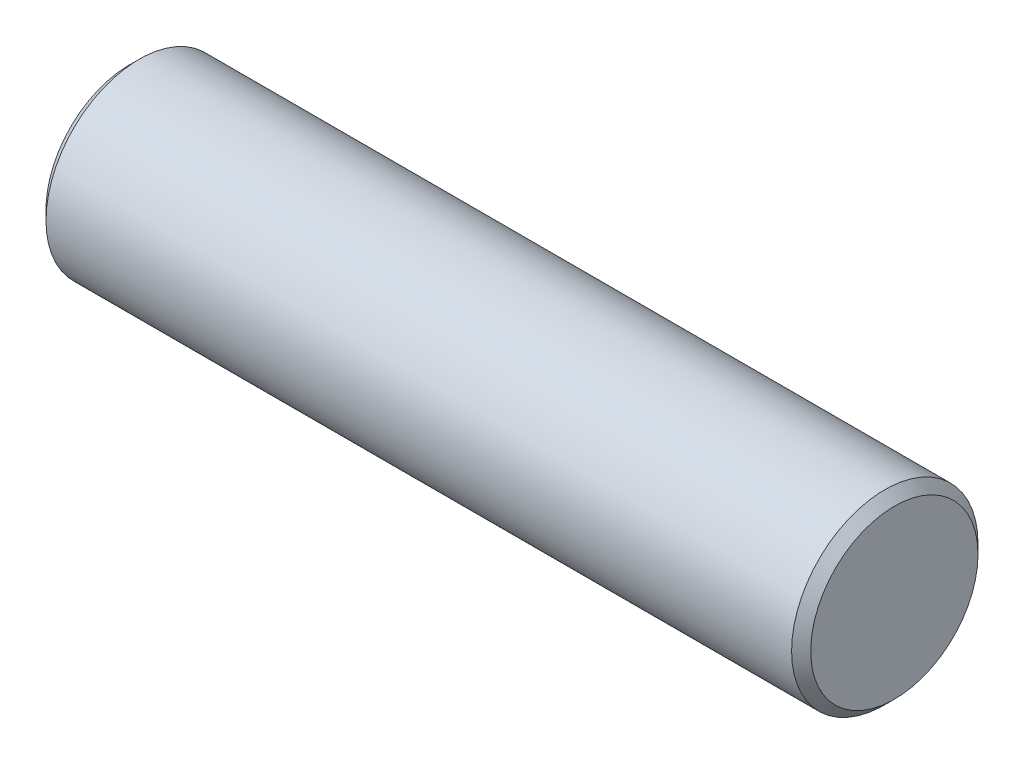
ISO-10303-21;
HEADER;
FILE_DESCRIPTION(('STEP AP214'),'2;1');
FILE_NAME('part.step','',(''),(''),'','','');
FILE_SCHEMA(('AUTOMOTIVE_DESIGN { 1 0 10303 214 1 1 1 1 }'));
ENDSEC;
DATA;
#1=APPLICATION_CONTEXT('core data for automotive mechanical design processes');
#2=APPLICATION_PROTOCOL_DEFINITION('international standard','automotive_design',2000,#1);
#3=PRODUCT_CONTEXT('',#1,'mechanical');
#4=PRODUCT('Part','Part','',(#3));
#5=PRODUCT_RELATED_PRODUCT_CATEGORY('part','',(#4));
#6=PRODUCT_DEFINITION_FORMATION('','',#4);
#7=PRODUCT_DEFINITION_CONTEXT('part definition',#1,'design');
#8=PRODUCT_DEFINITION('design','',#6,#7);
#9=PRODUCT_DEFINITION_SHAPE('','',#8);
#10=(LENGTH_UNIT() NAMED_UNIT(*) SI_UNIT(.MILLI.,.METRE.));
#11=(NAMED_UNIT(*) PLANE_ANGLE_UNIT() SI_UNIT($,.RADIAN.));
#12=(NAMED_UNIT(*) SI_UNIT($,.STERADIAN.) SOLID_ANGLE_UNIT());
#13=UNCERTAINTY_MEASURE_WITH_UNIT(LENGTH_MEASURE(1.E-05),#10,'distance_accuracy_value','');
#14=(GEOMETRIC_REPRESENTATION_CONTEXT(3) GLOBAL_UNCERTAINTY_ASSIGNED_CONTEXT((#13)) GLOBAL_UNIT_ASSIGNED_CONTEXT((#10,
#11,#12)) REPRESENTATION_CONTEXT('',''));
#15=CARTESIAN_POINT('',(0.,0.,0.));
#16=DIRECTION('',(0.,0.,1.));
#17=DIRECTION('',(1.,0.,0.));
#18=AXIS2_PLACEMENT_3D('',#15,#16,#17);
#19=CARTESIAN_POINT('',(80.,0.,0.));
#20=DIRECTION('',(-1.,0.,0.));
#21=DIRECTION('',(0.,0.,1.));
#22=AXIS2_PLACEMENT_3D('',#19,#20,#21);
#23=CYLINDRICAL_SURFACE('',#22,9.75);
#24=CARTESIAN_POINT('',(79.,0.,0.));
#25=DIRECTION('',(1.,0.,0.));
#26=DIRECTION('',(0.,0.,-1.));
#27=AXIS2_PLACEMENT_3D('',#24,#25,#26);
#28=CIRCLE('',#27,9.75);
#29=CARTESIAN_POINT('',(79.,0.,-9.75));
#30=VERTEX_POINT('',#29);
#31=EDGE_CURVE('E50',#30,#30,#28,.F.);
#32=ORIENTED_EDGE('',*,*,#31,.T.);
#33=EDGE_LOOP('',(#32));
#34=FACE_BOUND('',#33,.T.);
#35=CARTESIAN_POINT('',(1.00000000000001,0.,0.));
#36=DIRECTION('',(1.,0.,0.));
#37=DIRECTION('',(0.,0.,-1.));
#38=AXIS2_PLACEMENT_3D('',#35,#36,#37);
#39=CIRCLE('',#38,9.75);
#40=CARTESIAN_POINT('',(1.00000000000001,0.,-9.75));
#41=VERTEX_POINT('',#40);
#42=EDGE_CURVE('E51',#41,#41,#39,.T.);
#43=ORIENTED_EDGE('',*,*,#42,.T.);
#44=EDGE_LOOP('',(#43));
#45=FACE_BOUND('',#44,.T.);
#46=ADVANCED_FACE('F39',(#34,#45),#23,.T.);
#47=CARTESIAN_POINT('',(80.,0.,0.));
#48=DIRECTION('',(1.,0.,0.));
#49=DIRECTION('',(0.,0.,-1.));
#50=AXIS2_PLACEMENT_3D('',#47,#48,#49);
#51=PLANE('',#50);
#52=CARTESIAN_POINT('',(80.,0.,0.));
#53=DIRECTION('',(1.,0.,0.));
#54=DIRECTION('',(0.,0.,-1.));
#55=AXIS2_PLACEMENT_3D('',#52,#53,#54);
#56=CIRCLE('',#55,8.75000000000001);
#57=CARTESIAN_POINT('',(80.,0.,-8.75000000000001));
#58=VERTEX_POINT('',#57);
#59=EDGE_CURVE('E54',#58,#58,#56,.T.);
#60=ORIENTED_EDGE('',*,*,#59,.T.);
#61=EDGE_LOOP('',(#60));
#62=FACE_BOUND('',#61,.T.);
#63=ADVANCED_FACE('F61',(#62),#51,.T.);
#64=CARTESIAN_POINT('',(0.,0.,0.));
#65=DIRECTION('',(1.,0.,0.));
#66=DIRECTION('',(0.,0.,-1.));
#67=AXIS2_PLACEMENT_3D('',#64,#65,#66);
#68=PLANE('',#67);
#69=CARTESIAN_POINT('',(0.,0.,0.));
#70=DIRECTION('',(1.,0.,0.));
#71=DIRECTION('',(0.,0.,-1.));
#72=AXIS2_PLACEMENT_3D('',#69,#70,#71);
#73=CIRCLE('',#72,8.74999999999997);
#74=CARTESIAN_POINT('',(0.,0.,-8.74999999999997));
#75=VERTEX_POINT('',#74);
#76=EDGE_CURVE('E10',#75,#75,#73,.F.);
#77=ORIENTED_EDGE('',*,*,#76,.T.);
#78=EDGE_LOOP('',(#77));
#79=FACE_BOUND('',#78,.T.);
#80=ADVANCED_FACE('F64',(#79),#68,.F.);
#81=CARTESIAN_POINT('',(80.,0.,0.));
#82=DIRECTION('',(-1.,0.,0.));
#83=DIRECTION('',(0.,0.,1.));
#84=AXIS2_PLACEMENT_3D('',#81,#82,#83);
#85=CONICAL_SURFACE('',#84,8.75000000000001,0.785398163397458);
#86=ORIENTED_EDGE('',*,*,#31,.F.);
#87=EDGE_LOOP('',(#86));
#88=FACE_BOUND('',#87,.T.);
#89=ORIENTED_EDGE('',*,*,#59,.F.);
#90=EDGE_LOOP('',(#89));
#91=FACE_BOUND('',#90,.T.);
#92=ADVANCED_FACE('F62',(#88,#91),#85,.T.);
#93=CARTESIAN_POINT('',(1.00000000000001,0.,0.));
#94=DIRECTION('',(1.,0.,0.));
#95=DIRECTION('',(0.,0.,-1.));
#96=AXIS2_PLACEMENT_3D('',#93,#94,#95);
#97=CONICAL_SURFACE('',#96,9.75,0.785398163397458);
#98=ORIENTED_EDGE('',*,*,#76,.F.);
#99=EDGE_LOOP('',(#98));
#100=FACE_BOUND('',#99,.T.);
#101=ORIENTED_EDGE('',*,*,#42,.F.);
#102=EDGE_LOOP('',(#101));
#103=FACE_BOUND('',#102,.T.);
#104=ADVANCED_FACE('F45',(#100,#103),#97,.T.);
#105=CLOSED_SHELL('',(#46,#63,#80,#92,#104));
#106=MANIFOLD_SOLID_BREP('B2',#105);
#107=ADVANCED_BREP_SHAPE_REPRESENTATION('',(#18,#106),#14);
#108=SHAPE_DEFINITION_REPRESENTATION(#9,#107);
ENDSEC;
END-ISO-10303-21;
